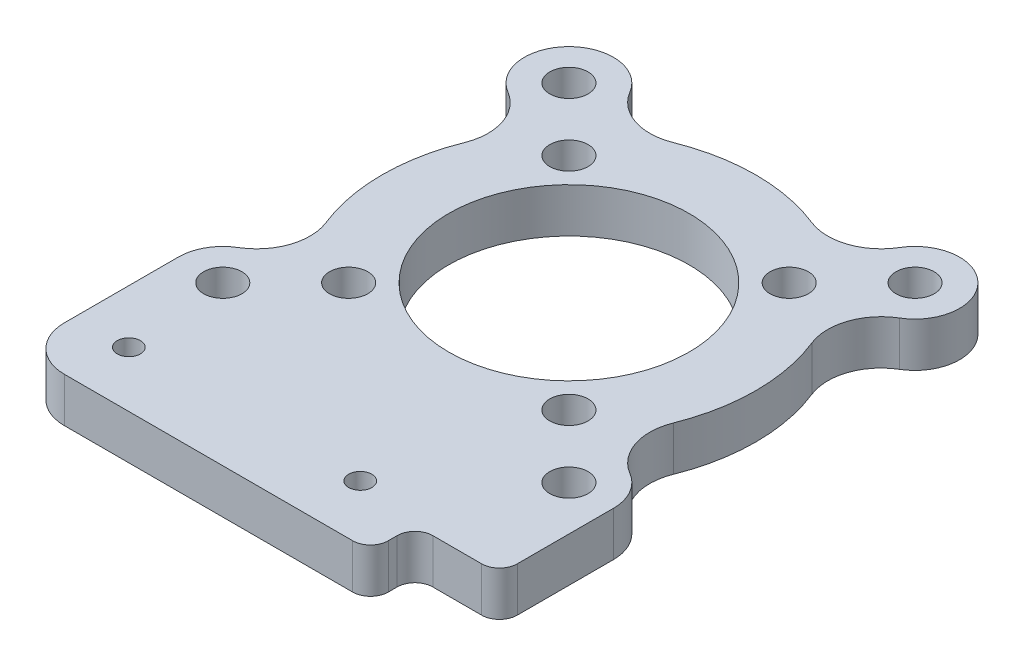
ISO-10303-21;
HEADER;
FILE_DESCRIPTION(('STEP AP214'),'2;1');
FILE_NAME('part.step','',(''),(''),'','','');
FILE_SCHEMA(('AUTOMOTIVE_DESIGN { 1 0 10303 214 1 1 1 1 }'));
ENDSEC;
DATA;
#1=APPLICATION_CONTEXT('core data for automotive mechanical design processes');
#2=APPLICATION_PROTOCOL_DEFINITION('international standard','automotive_design',2000,#1);
#3=PRODUCT_CONTEXT('',#1,'mechanical');
#4=PRODUCT('Part','Part','',(#3));
#5=PRODUCT_RELATED_PRODUCT_CATEGORY('part','',(#4));
#6=PRODUCT_DEFINITION_FORMATION('','',#4);
#7=PRODUCT_DEFINITION_CONTEXT('part definition',#1,'design');
#8=PRODUCT_DEFINITION('design','',#6,#7);
#9=PRODUCT_DEFINITION_SHAPE('','',#8);
#10=(LENGTH_UNIT() NAMED_UNIT(*) SI_UNIT(.MILLI.,.METRE.));
#11=(NAMED_UNIT(*) PLANE_ANGLE_UNIT() SI_UNIT($,.RADIAN.));
#12=(NAMED_UNIT(*) SI_UNIT($,.STERADIAN.) SOLID_ANGLE_UNIT());
#13=UNCERTAINTY_MEASURE_WITH_UNIT(LENGTH_MEASURE(1.E-05),#10,'distance_accuracy_value','');
#14=(GEOMETRIC_REPRESENTATION_CONTEXT(3) GLOBAL_UNCERTAINTY_ASSIGNED_CONTEXT((#13)) GLOBAL_UNIT_ASSIGNED_CONTEXT((#10,
#11,#12)) REPRESENTATION_CONTEXT('',''));
#15=CARTESIAN_POINT('',(0.,0.,0.));
#16=DIRECTION('',(0.,0.,1.));
#17=DIRECTION('',(1.,0.,0.));
#18=AXIS2_PLACEMENT_3D('',#15,#16,#17);
#19=CARTESIAN_POINT('',(-19.4454364826302,5.,32.25));
#20=DIRECTION('',(0.,-1.,0.));
#21=DIRECTION('',(0.,0.,-1.));
#22=AXIS2_PLACEMENT_3D('',#19,#20,#21);
#23=CYLINDRICAL_SURFACE('',#22,5.);
#24=CARTESIAN_POINT('',(-19.4454364826302,0.,32.25));
#25=DIRECTION('',(0.,1.,0.));
#26=DIRECTION('',(0.,0.,1.));
#27=AXIS2_PLACEMENT_3D('',#24,#25,#26);
#28=CIRCLE('',#27,5.);
#29=CARTESIAN_POINT('',(-19.4454364826302,0.,37.25));
#30=VERTEX_POINT('',#29);
#31=CARTESIAN_POINT('',(-24.4454364826302,0.,32.25));
#32=VERTEX_POINT('',#31);
#33=EDGE_CURVE('E193',#30,#32,#28,.F.);
#34=ORIENTED_EDGE('',*,*,#33,.F.);
#35=DIRECTION('',(0.,-1.,0.));
#36=VECTOR('',#35,1.);
#37=CARTESIAN_POINT('',(-19.4454364826302,5.,37.25));
#38=LINE('',#37,#36);
#39=CARTESIAN_POINT('',(-19.4454364826302,5.,37.25));
#40=VERTEX_POINT('',#39);
#41=EDGE_CURVE('E187',#40,#30,#38,.T.);
#42=ORIENTED_EDGE('',*,*,#41,.F.);
#43=CARTESIAN_POINT('',(-19.4454364826302,5.,32.25));
#44=DIRECTION('',(0.,1.,0.));
#45=DIRECTION('',(0.,0.,1.));
#46=AXIS2_PLACEMENT_3D('',#43,#44,#45);
#47=CIRCLE('',#46,5.);
#48=CARTESIAN_POINT('',(-24.4454364826302,5.,32.25));
#49=VERTEX_POINT('',#48);
#50=EDGE_CURVE('E190',#40,#49,#47,.F.);
#51=ORIENTED_EDGE('',*,*,#50,.T.);
#52=DIRECTION('',(0.,-1.,0.));
#53=VECTOR('',#52,1.);
#54=CARTESIAN_POINT('',(-24.4454364826302,5.,32.25));
#55=LINE('',#54,#53);
#56=EDGE_CURVE('E290',#49,#32,#55,.T.);
#57=ORIENTED_EDGE('',*,*,#56,.T.);
#58=EDGE_LOOP('',(#34,#42,#51,#57));
#59=FACE_BOUND('',#58,.T.);
#60=ADVANCED_FACE('F37',(#59),#23,.T.);
#61=CARTESIAN_POINT('',(0.,5.,37.25));
#62=DIRECTION('',(0.,0.,-1.));
#63=DIRECTION('',(-1.,0.,0.));
#64=AXIS2_PLACEMENT_3D('',#61,#62,#63);
#65=PLANE('',#64);
#66=DIRECTION('',(1.,0.,0.));
#67=VECTOR('',#66,1.);
#68=CARTESIAN_POINT('',(0.,0.,37.25));
#69=LINE('',#68,#67);
#70=CARTESIAN_POINT('',(12.95321446555,0.,37.25));
#71=VERTEX_POINT('',#70);
#72=EDGE_CURVE('E295',#30,#71,#69,.T.);
#73=ORIENTED_EDGE('',*,*,#72,.T.);
#74=DIRECTION('',(0.,-1.,0.));
#75=VECTOR('',#74,1.);
#76=CARTESIAN_POINT('',(12.95321446555,5.,37.25));
#77=LINE('',#76,#75);
#78=CARTESIAN_POINT('',(12.95321446555,5.,37.25));
#79=VERTEX_POINT('',#78);
#80=EDGE_CURVE('E204',#71,#79,#77,.F.);
#81=ORIENTED_EDGE('',*,*,#80,.T.);
#82=DIRECTION('',(1.,0.,0.));
#83=VECTOR('',#82,1.);
#84=CARTESIAN_POINT('',(0.,5.,37.25));
#85=LINE('',#84,#83);
#86=EDGE_CURVE('E201',#40,#79,#85,.T.);
#87=ORIENTED_EDGE('',*,*,#86,.F.);
#88=ORIENTED_EDGE('',*,*,#41,.T.);
#89=EDGE_LOOP('',(#73,#81,#87,#88));
#90=FACE_BOUND('',#89,.T.);
#91=ADVANCED_FACE('F202',(#90),#65,.F.);
#92=CARTESIAN_POINT('',(14.9532144655482,5.,-7.88566642110954E-13));
#93=DIRECTION('',(-1.,0.,0.));
#94=DIRECTION('',(0.,0.,1.));
#95=AXIS2_PLACEMENT_3D('',#92,#93,#94);
#96=PLANE('',#95);
#97=DIRECTION('',(0.,0.,-1.));
#98=VECTOR('',#97,1.);
#99=CARTESIAN_POINT('',(14.9532144655482,5.,-7.88566642110954E-13));
#100=LINE('',#99,#98);
#101=CARTESIAN_POINT('',(14.95321446555,5.,35.2499999999999));
#102=VERTEX_POINT('',#101);
#103=CARTESIAN_POINT('',(14.95321446555,5.,34.2500000000001));
#104=VERTEX_POINT('',#103);
#105=EDGE_CURVE('E206',#102,#104,#100,.T.);
#106=ORIENTED_EDGE('',*,*,#105,.F.);
#107=DIRECTION('',(0.,-1.,0.));
#108=VECTOR('',#107,1.);
#109=CARTESIAN_POINT('',(14.95321446555,5.,35.2499999999999));
#110=LINE('',#109,#108);
#111=CARTESIAN_POINT('',(14.95321446555,0.,35.2499999999999));
#112=VERTEX_POINT('',#111);
#113=EDGE_CURVE('E411',#102,#112,#110,.T.);
#114=ORIENTED_EDGE('',*,*,#113,.T.);
#115=DIRECTION('',(0.,0.,-1.));
#116=VECTOR('',#115,1.);
#117=CARTESIAN_POINT('',(14.9532144655482,0.,-7.88566642110954E-13));
#118=LINE('',#117,#116);
#119=CARTESIAN_POINT('',(14.95321446555,0.,34.2500000000001));
#120=VERTEX_POINT('',#119);
#121=EDGE_CURVE('E297',#112,#120,#118,.T.);
#122=ORIENTED_EDGE('',*,*,#121,.T.);
#123=DIRECTION('',(0.,-1.,0.));
#124=VECTOR('',#123,1.);
#125=CARTESIAN_POINT('',(14.95321446555,5.,34.2500000000001));
#126=LINE('',#125,#124);
#127=EDGE_CURVE('E197',#120,#104,#126,.F.);
#128=ORIENTED_EDGE('',*,*,#127,.T.);
#129=EDGE_LOOP('',(#106,#114,#122,#128));
#130=FACE_BOUND('',#129,.T.);
#131=ADVANCED_FACE('F438',(#130),#96,.F.);
#132=CARTESIAN_POINT('',(0.,5.,32.25));
#133=DIRECTION('',(0.,0.,-1.));
#134=DIRECTION('',(-1.,0.,0.));
#135=AXIS2_PLACEMENT_3D('',#132,#133,#134);
#136=PLANE('',#135);
#137=DIRECTION('',(1.,0.,0.));
#138=VECTOR('',#137,1.);
#139=CARTESIAN_POINT('',(0.,5.,32.25));
#140=LINE('',#139,#138);
#141=CARTESIAN_POINT('',(16.95321446555,5.,32.25));
#142=VERTEX_POINT('',#141);
#143=CARTESIAN_POINT('',(22.44543648263,5.,32.25));
#144=VERTEX_POINT('',#143);
#145=EDGE_CURVE('E220',#142,#144,#140,.T.);
#146=ORIENTED_EDGE('',*,*,#145,.F.);
#147=DIRECTION('',(0.,-1.,0.));
#148=VECTOR('',#147,1.);
#149=CARTESIAN_POINT('',(16.95321446555,0.,32.25));
#150=LINE('',#149,#148);
#151=CARTESIAN_POINT('',(16.95321446555,0.,32.25));
#152=VERTEX_POINT('',#151);
#153=EDGE_CURVE('E423',#142,#152,#150,.T.);
#154=ORIENTED_EDGE('',*,*,#153,.T.);
#155=DIRECTION('',(1.,0.,0.));
#156=VECTOR('',#155,1.);
#157=CARTESIAN_POINT('',(0.,0.,32.25));
#158=LINE('',#157,#156);
#159=CARTESIAN_POINT('',(22.44543648263,0.,32.25));
#160=VERTEX_POINT('',#159);
#161=EDGE_CURVE('E300',#152,#160,#158,.T.);
#162=ORIENTED_EDGE('',*,*,#161,.T.);
#163=DIRECTION('',(0.,-1.,0.));
#164=VECTOR('',#163,1.);
#165=CARTESIAN_POINT('',(22.44543648263,5.,32.25));
#166=LINE('',#165,#164);
#167=EDGE_CURVE('E60',#160,#144,#166,.F.);
#168=ORIENTED_EDGE('',*,*,#167,.T.);
#169=EDGE_LOOP('',(#146,#154,#162,#168));
#170=FACE_BOUND('',#169,.T.);
#171=ADVANCED_FACE('F442',(#170),#136,.F.);
#172=CARTESIAN_POINT('',(24.4454364826299,5.,0.));
#173=DIRECTION('',(-1.,0.,0.));
#174=DIRECTION('',(0.,0.,1.));
#175=AXIS2_PLACEMENT_3D('',#172,#173,#174);
#176=PLANE('',#175);
#177=DIRECTION('',(0.,0.,-1.));
#178=VECTOR('',#177,1.);
#179=CARTESIAN_POINT('',(24.4454364826299,5.,0.));
#180=LINE('',#179,#178);
#181=CARTESIAN_POINT('',(24.44543648263,5.,30.25));
#182=VERTEX_POINT('',#181);
#183=CARTESIAN_POINT('',(24.4454364826299,5.,19.4454364826302));
#184=VERTEX_POINT('',#183);
#185=EDGE_CURVE('E222',#182,#184,#180,.T.);
#186=ORIENTED_EDGE('',*,*,#185,.F.);
#187=DIRECTION('',(0.,-1.,0.));
#188=VECTOR('',#187,1.);
#189=CARTESIAN_POINT('',(24.44543648263,5.,30.25));
#190=LINE('',#189,#188);
#191=CARTESIAN_POINT('',(24.44543648263,0.,30.25));
#192=VERTEX_POINT('',#191);
#193=EDGE_CURVE('E426',#182,#192,#190,.T.);
#194=ORIENTED_EDGE('',*,*,#193,.T.);
#195=DIRECTION('',(0.,0.,-1.));
#196=VECTOR('',#195,1.);
#197=CARTESIAN_POINT('',(24.4454364826299,0.,0.));
#198=LINE('',#197,#196);
#199=CARTESIAN_POINT('',(24.4454364826299,0.,19.4454364826302));
#200=VERTEX_POINT('',#199);
#201=EDGE_CURVE('E302',#192,#200,#198,.T.);
#202=ORIENTED_EDGE('',*,*,#201,.T.);
#203=DIRECTION('',(0.,-1.,0.));
#204=VECTOR('',#203,1.);
#205=CARTESIAN_POINT('',(24.4454364826299,5.,19.4454364826302));
#206=LINE('',#205,#204);
#207=EDGE_CURVE('E198',#184,#200,#206,.T.);
#208=ORIENTED_EDGE('',*,*,#207,.F.);
#209=EDGE_LOOP('',(#186,#194,#202,#208));
#210=FACE_BOUND('',#209,.T.);
#211=ADVANCED_FACE('F447',(#210),#176,.F.);
#212=CARTESIAN_POINT('',(19.4454364826299,5.,19.4454364826302));
#213=DIRECTION('',(0.,-1.,0.));
#214=DIRECTION('',(0.,0.,-1.));
#215=AXIS2_PLACEMENT_3D('',#212,#213,#214);
#216=CYLINDRICAL_SURFACE('',#215,5.);
#217=CARTESIAN_POINT('',(19.4454364826299,0.,19.4454364826302));
#218=DIRECTION('',(0.,1.,0.));
#219=DIRECTION('',(0.,0.,1.));
#220=AXIS2_PLACEMENT_3D('',#217,#218,#219);
#221=CIRCLE('',#220,5.);
#222=CARTESIAN_POINT('',(22.0068293742096,0.,15.1513397842587));
#223=VERTEX_POINT('',#222);
#224=EDGE_CURVE('E304',#200,#223,#221,.T.);
#225=ORIENTED_EDGE('',*,*,#224,.T.);
#226=DIRECTION('',(0.,-1.,0.));
#227=VECTOR('',#226,1.);
#228=CARTESIAN_POINT('',(22.0068293742096,5.,15.1513397842587));
#229=LINE('',#228,#227);
#230=CARTESIAN_POINT('',(22.0068293742096,5.,15.1513397842587));
#231=VERTEX_POINT('',#230);
#232=EDGE_CURVE('E405',#231,#223,#229,.T.);
#233=ORIENTED_EDGE('',*,*,#232,.F.);
#234=CARTESIAN_POINT('',(19.4454364826299,5.,19.4454364826302));
#235=DIRECTION('',(0.,1.,0.));
#236=DIRECTION('',(0.,0.,1.));
#237=AXIS2_PLACEMENT_3D('',#234,#235,#236);
#238=CIRCLE('',#237,5.);
#239=EDGE_CURVE('E224',#184,#231,#238,.T.);
#240=ORIENTED_EDGE('',*,*,#239,.F.);
#241=ORIENTED_EDGE('',*,*,#207,.T.);
#242=EDGE_LOOP('',(#225,#233,#240,#241));
#243=FACE_BOUND('',#242,.T.);
#244=ADVANCED_FACE('F453',(#243),#216,.T.);
#245=CARTESIAN_POINT('',(25.0805008441053,5.,9.99842374621289));
#246=DIRECTION('',(0.,-1.,0.));
#247=DIRECTION('',(0.,0.,-1.));
#248=AXIS2_PLACEMENT_3D('',#245,#246,#247);
#249=CYLINDRICAL_SURFACE('',#248,6.);
#250=CARTESIAN_POINT('',(25.0805008441053,0.,9.99842374621289));
#251=DIRECTION('',(0.,1.,0.));
#252=DIRECTION('',(0.,0.,1.));
#253=AXIS2_PLACEMENT_3D('',#250,#251,#252);
#254=CIRCLE('',#253,6.);
#255=CARTESIAN_POINT('',(19.5070562120817,0.,7.77655180261042));
#256=VERTEX_POINT('',#255);
#257=EDGE_CURVE('E307',#223,#256,#254,.F.);
#258=ORIENTED_EDGE('',*,*,#257,.T.);
#259=DIRECTION('',(0.,-1.,0.));
#260=VECTOR('',#259,1.);
#261=CARTESIAN_POINT('',(19.5070562120817,5.,7.77655180261042));
#262=LINE('',#261,#260);
#263=CARTESIAN_POINT('',(19.5070562120817,5.,7.77655180261042));
#264=VERTEX_POINT('',#263);
#265=EDGE_CURVE('E402',#264,#256,#262,.T.);
#266=ORIENTED_EDGE('',*,*,#265,.F.);
#267=CARTESIAN_POINT('',(25.0805008441053,5.,9.99842374621289));
#268=DIRECTION('',(0.,1.,0.));
#269=DIRECTION('',(0.,0.,1.));
#270=AXIS2_PLACEMENT_3D('',#267,#268,#269);
#271=CIRCLE('',#270,6.);
#272=EDGE_CURVE('E227',#231,#264,#271,.F.);
#273=ORIENTED_EDGE('',*,*,#272,.F.);
#274=ORIENTED_EDGE('',*,*,#232,.T.);
#275=EDGE_LOOP('',(#258,#266,#273,#274));
#276=FACE_BOUND('',#275,.T.);
#277=ADVANCED_FACE('F458',(#276),#249,.F.);
#278=CARTESIAN_POINT('',(0.,5.,0.));
#279=DIRECTION('',(0.,-1.,0.));
#280=DIRECTION('',(0.,0.,-1.));
#281=AXIS2_PLACEMENT_3D('',#278,#279,#280);
#282=CYLINDRICAL_SURFACE('',#281,21.);
#283=CARTESIAN_POINT('',(0.,0.,0.));
#284=DIRECTION('',(0.,1.,0.));
#285=DIRECTION('',(0.,0.,1.));
#286=AXIS2_PLACEMENT_3D('',#283,#284,#285);
#287=CIRCLE('',#286,21.);
#288=CARTESIAN_POINT('',(19.507056212082,0.,-7.77655180260981));
#289=VERTEX_POINT('',#288);
#290=EDGE_CURVE('E310',#256,#289,#287,.T.);
#291=ORIENTED_EDGE('',*,*,#290,.T.);
#292=DIRECTION('',(0.,-1.,0.));
#293=VECTOR('',#292,1.);
#294=CARTESIAN_POINT('',(19.507056212082,5.,-7.77655180260981));
#295=LINE('',#294,#293);
#296=CARTESIAN_POINT('',(19.507056212082,5.,-7.77655180260981));
#297=VERTEX_POINT('',#296);
#298=EDGE_CURVE('E400',#297,#289,#295,.T.);
#299=ORIENTED_EDGE('',*,*,#298,.F.);
#300=CARTESIAN_POINT('',(0.,5.,0.));
#301=DIRECTION('',(0.,1.,0.));
#302=DIRECTION('',(0.,0.,1.));
#303=AXIS2_PLACEMENT_3D('',#300,#301,#302);
#304=CIRCLE('',#303,21.);
#305=EDGE_CURVE('E230',#264,#297,#304,.T.);
#306=ORIENTED_EDGE('',*,*,#305,.F.);
#307=ORIENTED_EDGE('',*,*,#265,.T.);
#308=EDGE_LOOP('',(#291,#299,#306,#307));
#309=FACE_BOUND('',#308,.T.);
#310=ADVANCED_FACE('F460',(#309),#282,.T.);
#311=CARTESIAN_POINT('',(25.0805008441054,5.,-9.99842374621261));
#312=DIRECTION('',(0.,-1.,0.));
#313=DIRECTION('',(0.,0.,-1.));
#314=AXIS2_PLACEMENT_3D('',#311,#312,#313);
#315=CYLINDRICAL_SURFACE('',#314,6.);
#316=CARTESIAN_POINT('',(25.0805008441054,0.,-9.99842374621261));
#317=DIRECTION('',(0.,1.,0.));
#318=DIRECTION('',(0.,0.,1.));
#319=AXIS2_PLACEMENT_3D('',#316,#317,#318);
#320=CIRCLE('',#319,6.);
#321=CARTESIAN_POINT('',(22.00682937421,0.,-15.1513397842581));
#322=VERTEX_POINT('',#321);
#323=EDGE_CURVE('E313',#322,#289,#320,.T.);
#324=ORIENTED_EDGE('',*,*,#323,.F.);
#325=DIRECTION('',(0.,-1.,0.));
#326=VECTOR('',#325,1.);
#327=CARTESIAN_POINT('',(22.00682937421,5.,-15.1513397842581));
#328=LINE('',#327,#326);
#329=CARTESIAN_POINT('',(22.00682937421,5.,-15.1513397842581));
#330=VERTEX_POINT('',#329);
#331=EDGE_CURVE('E398',#330,#322,#328,.T.);
#332=ORIENTED_EDGE('',*,*,#331,.F.);
#333=CARTESIAN_POINT('',(25.0805008441054,5.,-9.99842374621261));
#334=DIRECTION('',(0.,1.,0.));
#335=DIRECTION('',(0.,0.,1.));
#336=AXIS2_PLACEMENT_3D('',#333,#334,#335);
#337=CIRCLE('',#336,6.);
#338=EDGE_CURVE('E232',#330,#297,#337,.T.);
#339=ORIENTED_EDGE('',*,*,#338,.T.);
#340=ORIENTED_EDGE('',*,*,#298,.T.);
#341=EDGE_LOOP('',(#324,#332,#339,#340));
#342=FACE_BOUND('',#341,.T.);
#343=ADVANCED_FACE('F463',(#342),#315,.F.);
#344=CARTESIAN_POINT('',(19.4454364826306,5.,-19.4454364826295));
#345=DIRECTION('',(0.,-1.,0.));
#346=DIRECTION('',(0.,0.,-1.));
#347=AXIS2_PLACEMENT_3D('',#344,#345,#346);
#348=CYLINDRICAL_SURFACE('',#347,4.99999999999986);
#349=CARTESIAN_POINT('',(19.4454364826306,0.,-19.4454364826295));
#350=DIRECTION('',(0.,1.,0.));
#351=DIRECTION('',(0.,0.,1.));
#352=AXIS2_PLACEMENT_3D('',#349,#350,#351);
#353=CIRCLE('',#352,4.99999999999986);
#354=CARTESIAN_POINT('',(15.1513397842593,0.,-22.0068293742093));
#355=VERTEX_POINT('',#354);
#356=EDGE_CURVE('E316',#322,#355,#353,.T.);
#357=ORIENTED_EDGE('',*,*,#356,.T.);
#358=DIRECTION('',(0.,-1.,0.));
#359=VECTOR('',#358,1.);
#360=CARTESIAN_POINT('',(15.1513397842593,5.,-22.0068293742093));
#361=LINE('',#360,#359);
#362=CARTESIAN_POINT('',(15.1513397842593,5.,-22.0068293742093));
#363=VERTEX_POINT('',#362);
#364=EDGE_CURVE('E395',#363,#355,#361,.T.);
#365=ORIENTED_EDGE('',*,*,#364,.F.);
#366=CARTESIAN_POINT('',(19.4454364826306,5.,-19.4454364826295));
#367=DIRECTION('',(0.,1.,0.));
#368=DIRECTION('',(0.,0.,1.));
#369=AXIS2_PLACEMENT_3D('',#366,#367,#368);
#370=CIRCLE('',#369,4.99999999999986);
#371=EDGE_CURVE('E235',#330,#363,#370,.T.);
#372=ORIENTED_EDGE('',*,*,#371,.F.);
#373=ORIENTED_EDGE('',*,*,#331,.T.);
#374=EDGE_LOOP('',(#357,#365,#372,#373));
#375=FACE_BOUND('',#374,.T.);
#376=ADVANCED_FACE('F468',(#375),#348,.T.);
#377=CARTESIAN_POINT('',(9.99842374621287,5.,-25.0805008441053));
#378=DIRECTION('',(0.,-1.,0.));
#379=DIRECTION('',(0.,0.,-1.));
#380=AXIS2_PLACEMENT_3D('',#377,#378,#379);
#381=CYLINDRICAL_SURFACE('',#380,6.00000000000014);
#382=CARTESIAN_POINT('',(9.99842374621287,0.,-25.0805008441053));
#383=DIRECTION('',(0.,1.,0.));
#384=DIRECTION('',(0.,0.,1.));
#385=AXIS2_PLACEMENT_3D('',#382,#383,#384);
#386=CIRCLE('',#385,6.00000000000014);
#387=CARTESIAN_POINT('',(7.77655180261037,0.,-19.5070562120816));
#388=VERTEX_POINT('',#387);
#389=EDGE_CURVE('E319',#355,#388,#386,.F.);
#390=ORIENTED_EDGE('',*,*,#389,.T.);
#391=DIRECTION('',(0.,-1.,0.));
#392=VECTOR('',#391,1.);
#393=CARTESIAN_POINT('',(7.77655180261037,5.,-19.5070562120816));
#394=LINE('',#393,#392);
#395=CARTESIAN_POINT('',(7.77655180261037,5.,-19.5070562120816));
#396=VERTEX_POINT('',#395);
#397=EDGE_CURVE('E392',#396,#388,#394,.T.);
#398=ORIENTED_EDGE('',*,*,#397,.F.);
#399=CARTESIAN_POINT('',(9.99842374621287,5.,-25.0805008441053));
#400=DIRECTION('',(0.,1.,0.));
#401=DIRECTION('',(0.,0.,1.));
#402=AXIS2_PLACEMENT_3D('',#399,#400,#401);
#403=CIRCLE('',#402,6.00000000000014);
#404=EDGE_CURVE('E238',#363,#396,#403,.F.);
#405=ORIENTED_EDGE('',*,*,#404,.F.);
#406=ORIENTED_EDGE('',*,*,#364,.T.);
#407=EDGE_LOOP('',(#390,#398,#405,#406));
#408=FACE_BOUND('',#407,.T.);
#409=ADVANCED_FACE('F471',(#408),#381,.F.);
#410=CARTESIAN_POINT('',(0.,5.,0.));
#411=DIRECTION('',(0.,-1.,0.));
#412=DIRECTION('',(0.,0.,-1.));
#413=AXIS2_PLACEMENT_3D('',#410,#411,#412);
#414=CYLINDRICAL_SURFACE('',#413,21.);
#415=CARTESIAN_POINT('',(0.,0.,0.));
#416=DIRECTION('',(0.,1.,0.));
#417=DIRECTION('',(0.,0.,1.));
#418=AXIS2_PLACEMENT_3D('',#415,#416,#417);
#419=CIRCLE('',#418,21.);
#420=CARTESIAN_POINT('',(-7.77655180260982,0.,-19.507056212082));
#421=VERTEX_POINT('',#420);
#422=EDGE_CURVE('E322',#388,#421,#419,.T.);
#423=ORIENTED_EDGE('',*,*,#422,.T.);
#424=DIRECTION('',(0.,-1.,0.));
#425=VECTOR('',#424,1.);
#426=CARTESIAN_POINT('',(-7.77655180260982,5.,-19.507056212082));
#427=LINE('',#426,#425);
#428=CARTESIAN_POINT('',(-7.77655180260982,5.,-19.507056212082));
#429=VERTEX_POINT('',#428);
#430=EDGE_CURVE('E390',#429,#421,#427,.T.);
#431=ORIENTED_EDGE('',*,*,#430,.F.);
#432=CARTESIAN_POINT('',(0.,5.,0.));
#433=DIRECTION('',(0.,1.,0.));
#434=DIRECTION('',(0.,0.,1.));
#435=AXIS2_PLACEMENT_3D('',#432,#433,#434);
#436=CIRCLE('',#435,21.);
#437=EDGE_CURVE('E241',#396,#429,#436,.T.);
#438=ORIENTED_EDGE('',*,*,#437,.F.);
#439=ORIENTED_EDGE('',*,*,#397,.T.);
#440=EDGE_LOOP('',(#423,#431,#438,#439));
#441=FACE_BOUND('',#440,.T.);
#442=ADVANCED_FACE('F473',(#441),#414,.T.);
#443=CARTESIAN_POINT('',(-9.99842374621262,5.,-25.0805008441054));
#444=DIRECTION('',(0.,-1.,0.));
#445=DIRECTION('',(0.,0.,-1.));
#446=AXIS2_PLACEMENT_3D('',#443,#444,#445);
#447=CYLINDRICAL_SURFACE('',#446,5.99999999999997);
#448=CARTESIAN_POINT('',(-9.99842374621262,0.,-25.0805008441054));
#449=DIRECTION('',(0.,1.,0.));
#450=DIRECTION('',(0.,0.,1.));
#451=AXIS2_PLACEMENT_3D('',#448,#449,#450);
#452=CIRCLE('',#451,5.99999999999997);
#453=CARTESIAN_POINT('',(-15.1513397842584,0.,-22.0068293742098));
#454=VERTEX_POINT('',#453);
#455=EDGE_CURVE('E325',#454,#421,#452,.T.);
#456=ORIENTED_EDGE('',*,*,#455,.F.);
#457=DIRECTION('',(0.,-1.,0.));
#458=VECTOR('',#457,1.);
#459=CARTESIAN_POINT('',(-15.1513397842584,5.,-22.0068293742098));
#460=LINE('',#459,#458);
#461=CARTESIAN_POINT('',(-15.1513397842584,5.,-22.0068293742098));
#462=VERTEX_POINT('',#461);
#463=EDGE_CURVE('E388',#462,#454,#460,.T.);
#464=ORIENTED_EDGE('',*,*,#463,.F.);
#465=CARTESIAN_POINT('',(-9.99842374621262,5.,-25.0805008441054));
#466=DIRECTION('',(0.,1.,0.));
#467=DIRECTION('',(0.,0.,1.));
#468=AXIS2_PLACEMENT_3D('',#465,#466,#467);
#469=CIRCLE('',#468,5.99999999999997);
#470=EDGE_CURVE('E243',#462,#429,#469,.T.);
#471=ORIENTED_EDGE('',*,*,#470,.T.);
#472=ORIENTED_EDGE('',*,*,#430,.T.);
#473=EDGE_LOOP('',(#456,#464,#471,#472));
#474=FACE_BOUND('',#473,.T.);
#475=ADVANCED_FACE('F480',(#474),#447,.F.);
#476=CARTESIAN_POINT('',(-19.4454364826299,5.,-19.4454364826302));
#477=DIRECTION('',(0.,-1.,0.));
#478=DIRECTION('',(0.,0.,-1.));
#479=AXIS2_PLACEMENT_3D('',#476,#477,#478);
#480=CYLINDRICAL_SURFACE('',#479,5.);
#481=CARTESIAN_POINT('',(-19.4454364826299,0.,-19.4454364826302));
#482=DIRECTION('',(0.,1.,0.));
#483=DIRECTION('',(0.,0.,1.));
#484=AXIS2_PLACEMENT_3D('',#481,#482,#483);
#485=CIRCLE('',#484,5.);
#486=CARTESIAN_POINT('',(-22.0068293742096,0.,-15.1513397842587));
#487=VERTEX_POINT('',#486);
#488=EDGE_CURVE('E328',#454,#487,#485,.T.);
#489=ORIENTED_EDGE('',*,*,#488,.T.);
#490=DIRECTION('',(0.,-1.,0.));
#491=VECTOR('',#490,1.);
#492=CARTESIAN_POINT('',(-22.0068293742096,5.,-15.1513397842587));
#493=LINE('',#492,#491);
#494=CARTESIAN_POINT('',(-22.0068293742096,5.,-15.1513397842587));
#495=VERTEX_POINT('',#494);
#496=EDGE_CURVE('E385',#495,#487,#493,.T.);
#497=ORIENTED_EDGE('',*,*,#496,.F.);
#498=CARTESIAN_POINT('',(-19.4454364826299,5.,-19.4454364826302));
#499=DIRECTION('',(0.,1.,0.));
#500=DIRECTION('',(0.,0.,1.));
#501=AXIS2_PLACEMENT_3D('',#498,#499,#500);
#502=CIRCLE('',#501,5.);
#503=EDGE_CURVE('E246',#462,#495,#502,.T.);
#504=ORIENTED_EDGE('',*,*,#503,.F.);
#505=ORIENTED_EDGE('',*,*,#463,.T.);
#506=EDGE_LOOP('',(#489,#497,#504,#505));
#507=FACE_BOUND('',#506,.T.);
#508=ADVANCED_FACE('F483',(#507),#480,.T.);
#509=CARTESIAN_POINT('',(-25.0805008441053,5.,-9.99842374621291));
#510=DIRECTION('',(0.,-1.,0.));
#511=DIRECTION('',(0.,0.,-1.));
#512=AXIS2_PLACEMENT_3D('',#509,#510,#511);
#513=CYLINDRICAL_SURFACE('',#512,6.);
#514=CARTESIAN_POINT('',(-25.0805008441053,0.,-9.99842374621291));
#515=DIRECTION('',(0.,1.,0.));
#516=DIRECTION('',(0.,0.,1.));
#517=AXIS2_PLACEMENT_3D('',#514,#515,#516);
#518=CIRCLE('',#517,6.);
#519=CARTESIAN_POINT('',(-19.5070562120819,0.,-7.77655180261004));
#520=VERTEX_POINT('',#519);
#521=EDGE_CURVE('E331',#487,#520,#518,.F.);
#522=ORIENTED_EDGE('',*,*,#521,.T.);
#523=DIRECTION('',(0.,-1.,0.));
#524=VECTOR('',#523,1.);
#525=CARTESIAN_POINT('',(-19.5070562120819,5.,-7.77655180261004));
#526=LINE('',#525,#524);
#527=CARTESIAN_POINT('',(-19.5070562120819,5.,-7.77655180261004));
#528=VERTEX_POINT('',#527);
#529=EDGE_CURVE('E382',#528,#520,#526,.T.);
#530=ORIENTED_EDGE('',*,*,#529,.F.);
#531=CARTESIAN_POINT('',(-25.0805008441053,5.,-9.99842374621291));
#532=DIRECTION('',(0.,1.,0.));
#533=DIRECTION('',(0.,0.,1.));
#534=AXIS2_PLACEMENT_3D('',#531,#532,#533);
#535=CIRCLE('',#534,6.);
#536=EDGE_CURVE('E249',#495,#528,#535,.F.);
#537=ORIENTED_EDGE('',*,*,#536,.F.);
#538=ORIENTED_EDGE('',*,*,#496,.T.);
#539=EDGE_LOOP('',(#522,#530,#537,#538));
#540=FACE_BOUND('',#539,.T.);
#541=ADVANCED_FACE('F485',(#540),#513,.F.);
#542=CARTESIAN_POINT('',(0.,5.,0.));
#543=DIRECTION('',(0.,-1.,0.));
#544=DIRECTION('',(0.,0.,-1.));
#545=AXIS2_PLACEMENT_3D('',#542,#543,#544);
#546=CYLINDRICAL_SURFACE('',#545,21.);
#547=CARTESIAN_POINT('',(0.,0.,0.));
#548=DIRECTION('',(0.,1.,0.));
#549=DIRECTION('',(0.,0.,1.));
#550=AXIS2_PLACEMENT_3D('',#547,#548,#549);
#551=CIRCLE('',#550,21.);
#552=CARTESIAN_POINT('',(-19.507056212082,0.,7.77655180260982));
#553=VERTEX_POINT('',#552);
#554=EDGE_CURVE('E334',#520,#553,#551,.T.);
#555=ORIENTED_EDGE('',*,*,#554,.T.);
#556=DIRECTION('',(0.,-1.,0.));
#557=VECTOR('',#556,1.);
#558=CARTESIAN_POINT('',(-19.507056212082,5.,7.77655180260982));
#559=LINE('',#558,#557);
#560=CARTESIAN_POINT('',(-19.507056212082,5.,7.77655180260982));
#561=VERTEX_POINT('',#560);
#562=EDGE_CURVE('E380',#561,#553,#559,.T.);
#563=ORIENTED_EDGE('',*,*,#562,.F.);
#564=CARTESIAN_POINT('',(0.,5.,0.));
#565=DIRECTION('',(0.,1.,0.));
#566=DIRECTION('',(0.,0.,1.));
#567=AXIS2_PLACEMENT_3D('',#564,#565,#566);
#568=CIRCLE('',#567,21.);
#569=EDGE_CURVE('E252',#528,#561,#568,.T.);
#570=ORIENTED_EDGE('',*,*,#569,.F.);
#571=ORIENTED_EDGE('',*,*,#529,.T.);
#572=EDGE_LOOP('',(#555,#563,#570,#571));
#573=FACE_BOUND('',#572,.T.);
#574=ADVANCED_FACE('F490',(#573),#546,.T.);
#575=CARTESIAN_POINT('',(-25.0805008441054,5.,9.99842374621262));
#576=DIRECTION('',(0.,-1.,0.));
#577=DIRECTION('',(0.,0.,-1.));
#578=AXIS2_PLACEMENT_3D('',#575,#576,#577);
#579=CYLINDRICAL_SURFACE('',#578,5.99999999999998);
#580=CARTESIAN_POINT('',(-25.0805008441054,0.,9.99842374621262));
#581=DIRECTION('',(0.,1.,0.));
#582=DIRECTION('',(0.,0.,1.));
#583=AXIS2_PLACEMENT_3D('',#580,#581,#582);
#584=CIRCLE('',#583,5.99999999999998);
#585=CARTESIAN_POINT('',(-22.0068293742098,0.,15.1513397842584));
#586=VERTEX_POINT('',#585);
#587=EDGE_CURVE('E337',#586,#553,#584,.T.);
#588=ORIENTED_EDGE('',*,*,#587,.F.);
#589=DIRECTION('',(0.,-1.,0.));
#590=VECTOR('',#589,1.);
#591=CARTESIAN_POINT('',(-22.0068293742098,5.,15.1513397842584));
#592=LINE('',#591,#590);
#593=CARTESIAN_POINT('',(-22.0068293742098,5.,15.1513397842584));
#594=VERTEX_POINT('',#593);
#595=EDGE_CURVE('E378',#594,#586,#592,.T.);
#596=ORIENTED_EDGE('',*,*,#595,.F.);
#597=CARTESIAN_POINT('',(-25.0805008441054,5.,9.99842374621262));
#598=DIRECTION('',(0.,1.,0.));
#599=DIRECTION('',(0.,0.,1.));
#600=AXIS2_PLACEMENT_3D('',#597,#598,#599);
#601=CIRCLE('',#600,5.99999999999998);
#602=EDGE_CURVE('E254',#594,#561,#601,.T.);
#603=ORIENTED_EDGE('',*,*,#602,.T.);
#604=ORIENTED_EDGE('',*,*,#562,.T.);
#605=EDGE_LOOP('',(#588,#596,#603,#604));
#606=FACE_BOUND('',#605,.T.);
#607=ADVANCED_FACE('F493',(#606),#579,.F.);
#608=CARTESIAN_POINT('',(-19.4454364826302,5.,19.4454364826299));
#609=DIRECTION('',(0.,-1.,0.));
#610=DIRECTION('',(0.,0.,-1.));
#611=AXIS2_PLACEMENT_3D('',#608,#609,#610);
#612=CYLINDRICAL_SURFACE('',#611,4.99999999999999);
#613=CARTESIAN_POINT('',(-19.4454364826302,0.,19.4454364826299));
#614=DIRECTION('',(0.,1.,0.));
#615=DIRECTION('',(0.,0.,1.));
#616=AXIS2_PLACEMENT_3D('',#613,#614,#615);
#617=CIRCLE('',#616,4.99999999999999);
#618=CARTESIAN_POINT('',(-24.4454364826302,0.,19.44543648263));
#619=VERTEX_POINT('',#618);
#620=EDGE_CURVE('E340',#586,#619,#617,.T.);
#621=ORIENTED_EDGE('',*,*,#620,.T.);
#622=DIRECTION('',(0.,-1.,0.));
#623=VECTOR('',#622,1.);
#624=CARTESIAN_POINT('',(-24.4454364826302,5.,19.44543648263));
#625=LINE('',#624,#623);
#626=CARTESIAN_POINT('',(-24.4454364826302,5.,19.44543648263));
#627=VERTEX_POINT('',#626);
#628=EDGE_CURVE('E376',#627,#619,#625,.T.);
#629=ORIENTED_EDGE('',*,*,#628,.F.);
#630=CARTESIAN_POINT('',(-19.4454364826302,5.,19.4454364826299));
#631=DIRECTION('',(0.,1.,0.));
#632=DIRECTION('',(0.,0.,1.));
#633=AXIS2_PLACEMENT_3D('',#630,#631,#632);
#634=CIRCLE('',#633,4.99999999999999);
#635=EDGE_CURVE('E257',#594,#627,#634,.T.);
#636=ORIENTED_EDGE('',*,*,#635,.F.);
#637=ORIENTED_EDGE('',*,*,#595,.T.);
#638=EDGE_LOOP('',(#621,#629,#636,#637));
#639=FACE_BOUND('',#638,.T.);
#640=ADVANCED_FACE('F498',(#639),#612,.T.);
#641=CARTESIAN_POINT('',(12.3743686707646,5.,-12.3743686707646));
#642=DIRECTION('',(0.,-1.,0.));
#643=DIRECTION('',(0.,0.,-1.));
#644=AXIS2_PLACEMENT_3D('',#641,#642,#643);
#645=CYLINDRICAL_SURFACE('',#644,2.15000000000001);
#646=CARTESIAN_POINT('',(12.3743686707646,5.,-12.3743686707646));
#647=DIRECTION('',(0.,1.,0.));
#648=DIRECTION('',(0.,0.,1.));
#649=AXIS2_PLACEMENT_3D('',#646,#647,#648);
#650=CIRCLE('',#649,2.15000000000001);
#651=CARTESIAN_POINT('',(12.3743686707646,5.,-10.2243686707646));
#652=VERTEX_POINT('',#651);
#653=EDGE_CURVE('E284',#652,#652,#650,.T.);
#654=ORIENTED_EDGE('',*,*,#653,.T.);
#655=EDGE_LOOP('',(#654));
#656=FACE_BOUND('',#655,.T.);
#657=CARTESIAN_POINT('',(12.3743686707646,0.,-12.3743686707646));
#658=DIRECTION('',(0.,1.,0.));
#659=DIRECTION('',(0.,0.,1.));
#660=AXIS2_PLACEMENT_3D('',#657,#658,#659);
#661=CIRCLE('',#660,2.15000000000001);
#662=CARTESIAN_POINT('',(12.3743686707646,0.,-10.2243686707646));
#663=VERTEX_POINT('',#662);
#664=EDGE_CURVE('E370',#663,#663,#661,.T.);
#665=ORIENTED_EDGE('',*,*,#664,.F.);
#666=EDGE_LOOP('',(#665));
#667=FACE_BOUND('',#666,.T.);
#668=ADVANCED_FACE('F541',(#656,#667),#645,.F.);
#669=CARTESIAN_POINT('',(12.3743686707646,5.,12.3743686707646));
#670=DIRECTION('',(0.,-1.,0.));
#671=DIRECTION('',(0.,0.,-1.));
#672=AXIS2_PLACEMENT_3D('',#669,#670,#671);
#673=CYLINDRICAL_SURFACE('',#672,2.15);
#674=CARTESIAN_POINT('',(12.3743686707646,5.,12.3743686707646));
#675=DIRECTION('',(0.,1.,0.));
#676=DIRECTION('',(0.,0.,1.));
#677=AXIS2_PLACEMENT_3D('',#674,#675,#676);
#678=CIRCLE('',#677,2.15);
#679=CARTESIAN_POINT('',(12.3743686707646,5.,14.5243686707646));
#680=VERTEX_POINT('',#679);
#681=EDGE_CURVE('E281',#680,#680,#678,.T.);
#682=ORIENTED_EDGE('',*,*,#681,.T.);
#683=EDGE_LOOP('',(#682));
#684=FACE_BOUND('',#683,.T.);
#685=CARTESIAN_POINT('',(12.3743686707646,0.,12.3743686707646));
#686=DIRECTION('',(0.,1.,0.));
#687=DIRECTION('',(0.,0.,1.));
#688=AXIS2_PLACEMENT_3D('',#685,#686,#687);
#689=CIRCLE('',#688,2.15);
#690=CARTESIAN_POINT('',(12.3743686707646,0.,14.5243686707646));
#691=VERTEX_POINT('',#690);
#692=EDGE_CURVE('E367',#691,#691,#689,.T.);
#693=ORIENTED_EDGE('',*,*,#692,.F.);
#694=EDGE_LOOP('',(#693));
#695=FACE_BOUND('',#694,.T.);
#696=ADVANCED_FACE('F544',(#684,#695),#673,.F.);
#697=CARTESIAN_POINT('',(-12.3743686707646,5.,12.3743686707646));
#698=DIRECTION('',(0.,-1.,0.));
#699=DIRECTION('',(0.,0.,-1.));
#700=AXIS2_PLACEMENT_3D('',#697,#698,#699);
#701=CYLINDRICAL_SURFACE('',#700,2.15);
#702=CARTESIAN_POINT('',(-12.3743686707646,5.,12.3743686707646));
#703=DIRECTION('',(0.,1.,0.));
#704=DIRECTION('',(0.,0.,1.));
#705=AXIS2_PLACEMENT_3D('',#702,#703,#704);
#706=CIRCLE('',#705,2.15);
#707=CARTESIAN_POINT('',(-12.3743686707646,5.,14.5243686707646));
#708=VERTEX_POINT('',#707);
#709=EDGE_CURVE('E278',#708,#708,#706,.T.);
#710=ORIENTED_EDGE('',*,*,#709,.T.);
#711=EDGE_LOOP('',(#710));
#712=FACE_BOUND('',#711,.T.);
#713=CARTESIAN_POINT('',(-12.3743686707646,0.,12.3743686707646));
#714=DIRECTION('',(0.,1.,0.));
#715=DIRECTION('',(0.,0.,1.));
#716=AXIS2_PLACEMENT_3D('',#713,#714,#715);
#717=CIRCLE('',#716,2.15);
#718=CARTESIAN_POINT('',(-12.3743686707646,0.,14.5243686707646));
#719=VERTEX_POINT('',#718);
#720=EDGE_CURVE('E364',#719,#719,#717,.T.);
#721=ORIENTED_EDGE('',*,*,#720,.F.);
#722=EDGE_LOOP('',(#721));
#723=FACE_BOUND('',#722,.T.);
#724=ADVANCED_FACE('F548',(#712,#723),#701,.F.);
#725=CARTESIAN_POINT('',(-12.3743686707646,5.,-12.3743686707646));
#726=DIRECTION('',(0.,-1.,0.));
#727=DIRECTION('',(0.,0.,-1.));
#728=AXIS2_PLACEMENT_3D('',#725,#726,#727);
#729=CYLINDRICAL_SURFACE('',#728,2.15);
#730=CARTESIAN_POINT('',(-12.3743686707646,5.,-12.3743686707646));
#731=DIRECTION('',(0.,1.,0.));
#732=DIRECTION('',(0.,0.,1.));
#733=AXIS2_PLACEMENT_3D('',#730,#731,#732);
#734=CIRCLE('',#733,2.15);
#735=CARTESIAN_POINT('',(-12.3743686707646,5.,-10.2243686707646));
#736=VERTEX_POINT('',#735);
#737=EDGE_CURVE('E275',#736,#736,#734,.T.);
#738=ORIENTED_EDGE('',*,*,#737,.T.);
#739=EDGE_LOOP('',(#738));
#740=FACE_BOUND('',#739,.T.);
#741=CARTESIAN_POINT('',(-12.3743686707646,0.,-12.3743686707646));
#742=DIRECTION('',(0.,1.,0.));
#743=DIRECTION('',(0.,0.,1.));
#744=AXIS2_PLACEMENT_3D('',#741,#742,#743);
#745=CIRCLE('',#744,2.15);
#746=CARTESIAN_POINT('',(-12.3743686707646,0.,-10.2243686707646));
#747=VERTEX_POINT('',#746);
#748=EDGE_CURVE('E361',#747,#747,#745,.T.);
#749=ORIENTED_EDGE('',*,*,#748,.F.);
#750=EDGE_LOOP('',(#749));
#751=FACE_BOUND('',#750,.T.);
#752=ADVANCED_FACE('F552',(#740,#751),#729,.F.);
#753=CARTESIAN_POINT('',(19.4454364826306,5.,-19.4454364826295));
#754=DIRECTION('',(0.,-1.,0.));
#755=DIRECTION('',(0.,0.,-1.));
#756=AXIS2_PLACEMENT_3D('',#753,#754,#755);
#757=CYLINDRICAL_SURFACE('',#756,2.14999999999973);
#758=CARTESIAN_POINT('',(19.4454364826306,5.,-19.4454364826295));
#759=DIRECTION('',(0.,1.,0.));
#760=DIRECTION('',(0.,0.,1.));
#761=AXIS2_PLACEMENT_3D('',#758,#759,#760);
#762=CIRCLE('',#761,2.14999999999973);
#763=CARTESIAN_POINT('',(19.4454364826306,5.,-17.2954364826298));
#764=VERTEX_POINT('',#763);
#765=EDGE_CURVE('E272',#764,#764,#762,.T.);
#766=ORIENTED_EDGE('',*,*,#765,.T.);
#767=EDGE_LOOP('',(#766));
#768=FACE_BOUND('',#767,.T.);
#769=CARTESIAN_POINT('',(19.4454364826306,0.,-19.4454364826295));
#770=DIRECTION('',(0.,1.,0.));
#771=DIRECTION('',(0.,0.,1.));
#772=AXIS2_PLACEMENT_3D('',#769,#770,#771);
#773=CIRCLE('',#772,2.14999999999973);
#774=CARTESIAN_POINT('',(19.4454364826306,0.,-17.2954364826298));
#775=VERTEX_POINT('',#774);
#776=EDGE_CURVE('E358',#775,#775,#773,.T.);
#777=ORIENTED_EDGE('',*,*,#776,.F.);
#778=EDGE_LOOP('',(#777));
#779=FACE_BOUND('',#778,.T.);
#780=ADVANCED_FACE('F556',(#768,#779),#757,.F.);
#781=CARTESIAN_POINT('',(19.4454364826299,5.,19.4454364826302));
#782=DIRECTION('',(0.,-1.,0.));
#783=DIRECTION('',(0.,0.,-1.));
#784=AXIS2_PLACEMENT_3D('',#781,#782,#783);
#785=CYLINDRICAL_SURFACE('',#784,2.15);
#786=CARTESIAN_POINT('',(19.4454364826299,5.,19.4454364826302));
#787=DIRECTION('',(0.,1.,0.));
#788=DIRECTION('',(0.,0.,1.));
#789=AXIS2_PLACEMENT_3D('',#786,#787,#788);
#790=CIRCLE('',#789,2.15);
#791=CARTESIAN_POINT('',(19.4454364826299,5.,21.5954364826302));
#792=VERTEX_POINT('',#791);
#793=EDGE_CURVE('E269',#792,#792,#790,.T.);
#794=ORIENTED_EDGE('',*,*,#793,.T.);
#795=EDGE_LOOP('',(#794));
#796=FACE_BOUND('',#795,.T.);
#797=CARTESIAN_POINT('',(19.4454364826299,0.,19.4454364826302));
#798=DIRECTION('',(0.,1.,0.));
#799=DIRECTION('',(0.,0.,1.));
#800=AXIS2_PLACEMENT_3D('',#797,#798,#799);
#801=CIRCLE('',#800,2.15);
#802=CARTESIAN_POINT('',(19.4454364826299,0.,21.5954364826302));
#803=VERTEX_POINT('',#802);
#804=EDGE_CURVE('E355',#803,#803,#801,.T.);
#805=ORIENTED_EDGE('',*,*,#804,.F.);
#806=EDGE_LOOP('',(#805));
#807=FACE_BOUND('',#806,.T.);
#808=ADVANCED_FACE('F560',(#796,#807),#785,.F.);
#809=CARTESIAN_POINT('',(-19.4454364826302,5.,19.4454364826299));
#810=DIRECTION('',(0.,-1.,0.));
#811=DIRECTION('',(0.,0.,-1.));
#812=AXIS2_PLACEMENT_3D('',#809,#810,#811);
#813=CYLINDRICAL_SURFACE('',#812,2.15);
#814=CARTESIAN_POINT('',(-19.4454364826302,5.,19.4454364826299));
#815=DIRECTION('',(0.,1.,0.));
#816=DIRECTION('',(0.,0.,1.));
#817=AXIS2_PLACEMENT_3D('',#814,#815,#816);
#818=CIRCLE('',#817,2.15);
#819=CARTESIAN_POINT('',(-19.4454364826302,5.,21.5954364826299));
#820=VERTEX_POINT('',#819);
#821=EDGE_CURVE('E266',#820,#820,#818,.T.);
#822=ORIENTED_EDGE('',*,*,#821,.T.);
#823=EDGE_LOOP('',(#822));
#824=FACE_BOUND('',#823,.T.);
#825=CARTESIAN_POINT('',(-19.4454364826302,0.,19.4454364826299));
#826=DIRECTION('',(0.,1.,0.));
#827=DIRECTION('',(0.,0.,1.));
#828=AXIS2_PLACEMENT_3D('',#825,#826,#827);
#829=CIRCLE('',#828,2.15);
#830=CARTESIAN_POINT('',(-19.4454364826302,0.,21.5954364826299));
#831=VERTEX_POINT('',#830);
#832=EDGE_CURVE('E352',#831,#831,#829,.T.);
#833=ORIENTED_EDGE('',*,*,#832,.F.);
#834=EDGE_LOOP('',(#833));
#835=FACE_BOUND('',#834,.T.);
#836=ADVANCED_FACE('F564',(#824,#835),#813,.F.);
#837=CARTESIAN_POINT('',(-19.4454364826299,5.,-19.4454364826302));
#838=DIRECTION('',(0.,-1.,0.));
#839=DIRECTION('',(0.,0.,-1.));
#840=AXIS2_PLACEMENT_3D('',#837,#838,#839);
#841=CYLINDRICAL_SURFACE('',#840,2.15);
#842=CARTESIAN_POINT('',(-19.4454364826299,5.,-19.4454364826302));
#843=DIRECTION('',(0.,1.,0.));
#844=DIRECTION('',(0.,0.,1.));
#845=AXIS2_PLACEMENT_3D('',#842,#843,#844);
#846=CIRCLE('',#845,2.15);
#847=CARTESIAN_POINT('',(-19.4454364826299,5.,-17.2954364826302));
#848=VERTEX_POINT('',#847);
#849=EDGE_CURVE('E263',#848,#848,#846,.T.);
#850=ORIENTED_EDGE('',*,*,#849,.T.);
#851=EDGE_LOOP('',(#850));
#852=FACE_BOUND('',#851,.T.);
#853=CARTESIAN_POINT('',(-19.4454364826299,0.,-19.4454364826302));
#854=DIRECTION('',(0.,1.,0.));
#855=DIRECTION('',(0.,0.,1.));
#856=AXIS2_PLACEMENT_3D('',#853,#854,#855);
#857=CIRCLE('',#856,2.15);
#858=CARTESIAN_POINT('',(-19.4454364826299,0.,-17.2954364826302));
#859=VERTEX_POINT('',#858);
#860=EDGE_CURVE('E349',#859,#859,#857,.T.);
#861=ORIENTED_EDGE('',*,*,#860,.F.);
#862=EDGE_LOOP('',(#861));
#863=FACE_BOUND('',#862,.T.);
#864=ADVANCED_FACE('F568',(#852,#863),#841,.F.);
#865=CARTESIAN_POINT('',(7.55456351736985,5.,31.));
#866=DIRECTION('',(0.,-1.,0.));
#867=DIRECTION('',(0.,0.,-1.));
#868=AXIS2_PLACEMENT_3D('',#865,#866,#867);
#869=CYLINDRICAL_SURFACE('',#868,1.3);
#870=CARTESIAN_POINT('',(7.55456351736985,5.,31.));
#871=DIRECTION('',(0.,1.,0.));
#872=DIRECTION('',(0.,0.,1.));
#873=AXIS2_PLACEMENT_3D('',#870,#871,#872);
#874=CIRCLE('',#873,1.3);
#875=CARTESIAN_POINT('',(7.55456351736985,5.,32.3));
#876=VERTEX_POINT('',#875);
#877=EDGE_CURVE('E260',#876,#876,#874,.T.);
#878=ORIENTED_EDGE('',*,*,#877,.T.);
#879=EDGE_LOOP('',(#878));
#880=FACE_BOUND('',#879,.T.);
#881=CARTESIAN_POINT('',(7.55456351736985,0.,31.));
#882=DIRECTION('',(0.,1.,0.));
#883=DIRECTION('',(0.,0.,1.));
#884=AXIS2_PLACEMENT_3D('',#881,#882,#883);
#885=CIRCLE('',#884,1.3);
#886=CARTESIAN_POINT('',(7.55456351736985,0.,32.3));
#887=VERTEX_POINT('',#886);
#888=EDGE_CURVE('E346',#887,#887,#885,.T.);
#889=ORIENTED_EDGE('',*,*,#888,.F.);
#890=EDGE_LOOP('',(#889));
#891=FACE_BOUND('',#890,.T.);
#892=ADVANCED_FACE('F530',(#880,#891),#869,.F.);
#893=CARTESIAN_POINT('',(-24.4454364826302,5.,0.));
#894=DIRECTION('',(-1.,0.,0.));
#895=DIRECTION('',(0.,0.,1.));
#896=AXIS2_PLACEMENT_3D('',#893,#894,#895);
#897=PLANE('',#896);
#898=DIRECTION('',(0.,0.,-1.));
#899=VECTOR('',#898,1.);
#900=CARTESIAN_POINT('',(-24.4454364826302,0.,0.));
#901=LINE('',#900,#899);
#902=EDGE_CURVE('E343',#32,#619,#901,.T.);
#903=ORIENTED_EDGE('',*,*,#902,.F.);
#904=ORIENTED_EDGE('',*,*,#56,.F.);
#905=DIRECTION('',(0.,0.,-1.));
#906=VECTOR('',#905,1.);
#907=CARTESIAN_POINT('',(-24.4454364826302,5.,0.));
#908=LINE('',#907,#906);
#909=EDGE_CURVE('E211',#49,#627,#908,.T.);
#910=ORIENTED_EDGE('',*,*,#909,.T.);
#911=ORIENTED_EDGE('',*,*,#628,.T.);
#912=EDGE_LOOP('',(#903,#904,#910,#911));
#913=FACE_BOUND('',#912,.T.);
#914=ADVANCED_FACE('F501',(#913),#897,.T.);
#915=CARTESIAN_POINT('',(-18.4454364826302,5.,31.));
#916=DIRECTION('',(0.,-1.,0.));
#917=DIRECTION('',(0.,0.,-1.));
#918=AXIS2_PLACEMENT_3D('',#915,#916,#917);
#919=CYLINDRICAL_SURFACE('',#918,1.3);
#920=CARTESIAN_POINT('',(-18.4454364826302,5.,31.));
#921=DIRECTION('',(0.,1.,0.));
#922=DIRECTION('',(0.,0.,1.));
#923=AXIS2_PLACEMENT_3D('',#920,#921,#922);
#924=CIRCLE('',#923,1.3);
#925=CARTESIAN_POINT('',(-18.4454364826302,5.,32.3));
#926=VERTEX_POINT('',#925);
#927=EDGE_CURVE('E212',#926,#926,#924,.T.);
#928=ORIENTED_EDGE('',*,*,#927,.T.);
#929=EDGE_LOOP('',(#928));
#930=FACE_BOUND('',#929,.T.);
#931=CARTESIAN_POINT('',(-18.4454364826302,0.,31.));
#932=DIRECTION('',(0.,1.,0.));
#933=DIRECTION('',(0.,0.,1.));
#934=AXIS2_PLACEMENT_3D('',#931,#932,#933);
#935=CIRCLE('',#934,1.3);
#936=CARTESIAN_POINT('',(-18.4454364826302,0.,32.3));
#937=VERTEX_POINT('',#936);
#938=EDGE_CURVE('E291',#937,#937,#935,.T.);
#939=ORIENTED_EDGE('',*,*,#938,.F.);
#940=EDGE_LOOP('',(#939));
#941=FACE_BOUND('',#940,.T.);
#942=ADVANCED_FACE('F520',(#930,#941),#919,.F.);
#943=CARTESIAN_POINT('',(0.,5.,0.));
#944=DIRECTION('',(0.,-1.,0.));
#945=DIRECTION('',(0.,0.,-1.));
#946=AXIS2_PLACEMENT_3D('',#943,#944,#945);
#947=CYLINDRICAL_SURFACE('',#946,13.5);
#948=CARTESIAN_POINT('',(0.,5.,0.));
#949=DIRECTION('',(0.,1.,0.));
#950=DIRECTION('',(0.,0.,1.));
#951=AXIS2_PLACEMENT_3D('',#948,#949,#950);
#952=CIRCLE('',#951,13.5);
#953=CARTESIAN_POINT('',(0.,5.,13.5));
#954=VERTEX_POINT('',#953);
#955=EDGE_CURVE('E287',#954,#954,#952,.T.);
#956=ORIENTED_EDGE('',*,*,#955,.T.);
#957=EDGE_LOOP('',(#956));
#958=FACE_BOUND('',#957,.T.);
#959=CARTESIAN_POINT('',(0.,0.,0.));
#960=DIRECTION('',(0.,1.,0.));
#961=DIRECTION('',(0.,0.,1.));
#962=AXIS2_PLACEMENT_3D('',#959,#960,#961);
#963=CIRCLE('',#962,13.5);
#964=CARTESIAN_POINT('',(0.,0.,13.5));
#965=VERTEX_POINT('',#964);
#966=EDGE_CURVE('E215',#965,#965,#963,.T.);
#967=ORIENTED_EDGE('',*,*,#966,.F.);
#968=EDGE_LOOP('',(#967));
#969=FACE_BOUND('',#968,.T.);
#970=ADVANCED_FACE('F522',(#958,#969),#947,.F.);
#971=CARTESIAN_POINT('',(0.,5.,0.));
#972=DIRECTION('',(0.,1.,0.));
#973=DIRECTION('',(0.,0.,1.));
#974=AXIS2_PLACEMENT_3D('',#971,#972,#973);
#975=PLANE('',#974);
#976=ORIENTED_EDGE('',*,*,#927,.F.);
#977=EDGE_LOOP('',(#976));
#978=FACE_BOUND('',#977,.T.);
#979=ORIENTED_EDGE('',*,*,#86,.T.);
#980=CARTESIAN_POINT('',(12.95321446555,5.,35.25));
#981=DIRECTION('',(0.,1.,0.));
#982=DIRECTION('',(0.,0.,1.));
#983=AXIS2_PLACEMENT_3D('',#980,#981,#982);
#984=CIRCLE('',#983,2.);
#985=EDGE_CURVE('E420',#79,#102,#984,.T.);
#986=ORIENTED_EDGE('',*,*,#985,.T.);
#987=ORIENTED_EDGE('',*,*,#105,.T.);
#988=CARTESIAN_POINT('',(16.95321446555,5.,34.25));
#989=DIRECTION('',(0.,1.,0.));
#990=DIRECTION('',(0.,0.,1.));
#991=AXIS2_PLACEMENT_3D('',#988,#989,#990);
#992=CIRCLE('',#991,2.);
#993=EDGE_CURVE('E11',#104,#142,#992,.F.);
#994=ORIENTED_EDGE('',*,*,#993,.T.);
#995=ORIENTED_EDGE('',*,*,#145,.T.);
#996=CARTESIAN_POINT('',(22.44543648263,5.,30.25));
#997=DIRECTION('',(0.,1.,0.));
#998=DIRECTION('',(0.,0.,1.));
#999=AXIS2_PLACEMENT_3D('',#996,#997,#998);
#1000=CIRCLE('',#999,2.);
#1001=EDGE_CURVE('E52',#144,#182,#1000,.T.);
#1002=ORIENTED_EDGE('',*,*,#1001,.T.);
#1003=ORIENTED_EDGE('',*,*,#185,.T.);
#1004=ORIENTED_EDGE('',*,*,#239,.T.);
#1005=ORIENTED_EDGE('',*,*,#272,.T.);
#1006=ORIENTED_EDGE('',*,*,#305,.T.);
#1007=ORIENTED_EDGE('',*,*,#338,.F.);
#1008=ORIENTED_EDGE('',*,*,#371,.T.);
#1009=ORIENTED_EDGE('',*,*,#404,.T.);
#1010=ORIENTED_EDGE('',*,*,#437,.T.);
#1011=ORIENTED_EDGE('',*,*,#470,.F.);
#1012=ORIENTED_EDGE('',*,*,#503,.T.);
#1013=ORIENTED_EDGE('',*,*,#536,.T.);
#1014=ORIENTED_EDGE('',*,*,#569,.T.);
#1015=ORIENTED_EDGE('',*,*,#602,.F.);
#1016=ORIENTED_EDGE('',*,*,#635,.T.);
#1017=ORIENTED_EDGE('',*,*,#909,.F.);
#1018=ORIENTED_EDGE('',*,*,#50,.F.);
#1019=EDGE_LOOP('',(#979,#986,#987,#994,#995,#1002,#1003,#1004,#1005,#1006,#1007,#1008,#1009,
#1010,#1011,#1012,#1013,#1014,#1015,#1016,#1017,#1018));
#1020=FACE_BOUND('',#1019,.T.);
#1021=ORIENTED_EDGE('',*,*,#877,.F.);
#1022=EDGE_LOOP('',(#1021));
#1023=FACE_BOUND('',#1022,.T.);
#1024=ORIENTED_EDGE('',*,*,#849,.F.);
#1025=EDGE_LOOP('',(#1024));
#1026=FACE_BOUND('',#1025,.T.);
#1027=ORIENTED_EDGE('',*,*,#821,.F.);
#1028=EDGE_LOOP('',(#1027));
#1029=FACE_BOUND('',#1028,.T.);
#1030=ORIENTED_EDGE('',*,*,#793,.F.);
#1031=EDGE_LOOP('',(#1030));
#1032=FACE_BOUND('',#1031,.T.);
#1033=ORIENTED_EDGE('',*,*,#765,.F.);
#1034=EDGE_LOOP('',(#1033));
#1035=FACE_BOUND('',#1034,.T.);
#1036=ORIENTED_EDGE('',*,*,#737,.F.);
#1037=EDGE_LOOP('',(#1036));
#1038=FACE_BOUND('',#1037,.T.);
#1039=ORIENTED_EDGE('',*,*,#709,.F.);
#1040=EDGE_LOOP('',(#1039));
#1041=FACE_BOUND('',#1040,.T.);
#1042=ORIENTED_EDGE('',*,*,#681,.F.);
#1043=EDGE_LOOP('',(#1042));
#1044=FACE_BOUND('',#1043,.T.);
#1045=ORIENTED_EDGE('',*,*,#653,.F.);
#1046=EDGE_LOOP('',(#1045));
#1047=FACE_BOUND('',#1046,.T.);
#1048=ORIENTED_EDGE('',*,*,#955,.F.);
#1049=EDGE_LOOP('',(#1048));
#1050=FACE_BOUND('',#1049,.T.);
#1051=ADVANCED_FACE('F208',(#978,#1020,#1023,#1026,#1029,#1032,#1035,#1038,#1041,#1044,#1047,
#1050),#975,.T.);
#1052=CARTESIAN_POINT('',(0.,0.,0.));
#1053=DIRECTION('',(0.,1.,0.));
#1054=DIRECTION('',(0.,0.,1.));
#1055=AXIS2_PLACEMENT_3D('',#1052,#1053,#1054);
#1056=PLANE('',#1055);
#1057=ORIENTED_EDGE('',*,*,#938,.T.);
#1058=EDGE_LOOP('',(#1057));
#1059=FACE_BOUND('',#1058,.T.);
#1060=ORIENTED_EDGE('',*,*,#121,.F.);
#1061=CARTESIAN_POINT('',(12.95321446555,0.,35.25));
#1062=DIRECTION('',(0.,1.,0.));
#1063=DIRECTION('',(0.,0.,1.));
#1064=AXIS2_PLACEMENT_3D('',#1061,#1062,#1063);
#1065=CIRCLE('',#1064,2.);
#1066=EDGE_CURVE('E416',#112,#71,#1065,.F.);
#1067=ORIENTED_EDGE('',*,*,#1066,.T.);
#1068=ORIENTED_EDGE('',*,*,#72,.F.);
#1069=ORIENTED_EDGE('',*,*,#33,.T.);
#1070=ORIENTED_EDGE('',*,*,#902,.T.);
#1071=ORIENTED_EDGE('',*,*,#620,.F.);
#1072=ORIENTED_EDGE('',*,*,#587,.T.);
#1073=ORIENTED_EDGE('',*,*,#554,.F.);
#1074=ORIENTED_EDGE('',*,*,#521,.F.);
#1075=ORIENTED_EDGE('',*,*,#488,.F.);
#1076=ORIENTED_EDGE('',*,*,#455,.T.);
#1077=ORIENTED_EDGE('',*,*,#422,.F.);
#1078=ORIENTED_EDGE('',*,*,#389,.F.);
#1079=ORIENTED_EDGE('',*,*,#356,.F.);
#1080=ORIENTED_EDGE('',*,*,#323,.T.);
#1081=ORIENTED_EDGE('',*,*,#290,.F.);
#1082=ORIENTED_EDGE('',*,*,#257,.F.);
#1083=ORIENTED_EDGE('',*,*,#224,.F.);
#1084=ORIENTED_EDGE('',*,*,#201,.F.);
#1085=CARTESIAN_POINT('',(22.44543648263,0.,30.25));
#1086=DIRECTION('',(0.,1.,0.));
#1087=DIRECTION('',(0.,0.,1.));
#1088=AXIS2_PLACEMENT_3D('',#1085,#1086,#1087);
#1089=CIRCLE('',#1088,2.);
#1090=EDGE_CURVE('E414',#192,#160,#1089,.F.);
#1091=ORIENTED_EDGE('',*,*,#1090,.T.);
#1092=ORIENTED_EDGE('',*,*,#161,.F.);
#1093=CARTESIAN_POINT('',(16.95321446555,0.,34.25));
#1094=DIRECTION('',(0.,1.,0.));
#1095=DIRECTION('',(0.,0.,1.));
#1096=AXIS2_PLACEMENT_3D('',#1093,#1094,#1095);
#1097=CIRCLE('',#1096,2.);
#1098=EDGE_CURVE('E45',#152,#120,#1097,.T.);
#1099=ORIENTED_EDGE('',*,*,#1098,.T.);
#1100=EDGE_LOOP('',(#1060,#1067,#1068,#1069,#1070,#1071,#1072,#1073,#1074,#1075,#1076,#1077,
#1078,#1079,#1080,#1081,#1082,#1083,#1084,#1091,#1092,#1099));
#1101=FACE_BOUND('',#1100,.T.);
#1102=ORIENTED_EDGE('',*,*,#888,.T.);
#1103=EDGE_LOOP('',(#1102));
#1104=FACE_BOUND('',#1103,.T.);
#1105=ORIENTED_EDGE('',*,*,#860,.T.);
#1106=EDGE_LOOP('',(#1105));
#1107=FACE_BOUND('',#1106,.T.);
#1108=ORIENTED_EDGE('',*,*,#832,.T.);
#1109=EDGE_LOOP('',(#1108));
#1110=FACE_BOUND('',#1109,.T.);
#1111=ORIENTED_EDGE('',*,*,#804,.T.);
#1112=EDGE_LOOP('',(#1111));
#1113=FACE_BOUND('',#1112,.T.);
#1114=ORIENTED_EDGE('',*,*,#776,.T.);
#1115=EDGE_LOOP('',(#1114));
#1116=FACE_BOUND('',#1115,.T.);
#1117=ORIENTED_EDGE('',*,*,#748,.T.);
#1118=EDGE_LOOP('',(#1117));
#1119=FACE_BOUND('',#1118,.T.);
#1120=ORIENTED_EDGE('',*,*,#720,.T.);
#1121=EDGE_LOOP('',(#1120));
#1122=FACE_BOUND('',#1121,.T.);
#1123=ORIENTED_EDGE('',*,*,#692,.T.);
#1124=EDGE_LOOP('',(#1123));
#1125=FACE_BOUND('',#1124,.T.);
#1126=ORIENTED_EDGE('',*,*,#664,.T.);
#1127=EDGE_LOOP('',(#1126));
#1128=FACE_BOUND('',#1127,.T.);
#1129=ORIENTED_EDGE('',*,*,#966,.T.);
#1130=EDGE_LOOP('',(#1129));
#1131=FACE_BOUND('',#1130,.T.);
#1132=ADVANCED_FACE('F431',(#1059,#1101,#1104,#1107,#1110,#1113,#1116,#1119,#1122,#1125,#1128,
#1131),#1056,.F.);
#1133=CARTESIAN_POINT('',(12.95321446555,5.,35.25));
#1134=DIRECTION('',(0.,-1.,0.));
#1135=DIRECTION('',(0.,0.,-1.));
#1136=AXIS2_PLACEMENT_3D('',#1133,#1134,#1135);
#1137=CYLINDRICAL_SURFACE('',#1136,2.);
#1138=ORIENTED_EDGE('',*,*,#985,.F.);
#1139=ORIENTED_EDGE('',*,*,#80,.F.);
#1140=ORIENTED_EDGE('',*,*,#1066,.F.);
#1141=ORIENTED_EDGE('',*,*,#113,.F.);
#1142=EDGE_LOOP('',(#1138,#1139,#1140,#1141));
#1143=FACE_BOUND('',#1142,.T.);
#1144=ADVANCED_FACE('F503',(#1143),#1137,.T.);
#1145=CARTESIAN_POINT('',(16.95321446555,5.,34.25));
#1146=DIRECTION('',(0.,1.,0.));
#1147=DIRECTION('',(0.,0.,1.));
#1148=AXIS2_PLACEMENT_3D('',#1145,#1146,#1147);
#1149=CYLINDRICAL_SURFACE('',#1148,2.);
#1150=ORIENTED_EDGE('',*,*,#993,.F.);
#1151=ORIENTED_EDGE('',*,*,#127,.F.);
#1152=ORIENTED_EDGE('',*,*,#1098,.F.);
#1153=ORIENTED_EDGE('',*,*,#153,.F.);
#1154=EDGE_LOOP('',(#1150,#1151,#1152,#1153));
#1155=FACE_BOUND('',#1154,.T.);
#1156=ADVANCED_FACE('F441',(#1155),#1149,.F.);
#1157=CARTESIAN_POINT('',(22.44543648263,5.,30.25));
#1158=DIRECTION('',(0.,-1.,0.));
#1159=DIRECTION('',(0.,0.,-1.));
#1160=AXIS2_PLACEMENT_3D('',#1157,#1158,#1159);
#1161=CYLINDRICAL_SURFACE('',#1160,2.);
#1162=ORIENTED_EDGE('',*,*,#1001,.F.);
#1163=ORIENTED_EDGE('',*,*,#167,.F.);
#1164=ORIENTED_EDGE('',*,*,#1090,.F.);
#1165=ORIENTED_EDGE('',*,*,#193,.F.);
#1166=EDGE_LOOP('',(#1162,#1163,#1164,#1165));
#1167=FACE_BOUND('',#1166,.T.);
#1168=ADVANCED_FACE('F39',(#1167),#1161,.T.);
#1169=CLOSED_SHELL('',(#60,#91,#131,#171,#211,#244,#277,#310,#343,#376,#409,#442,#475,#508,#541,
#574,#607,#640,#668,#696,#724,#752,#780,#808,#836,#864,#892,#914,#942,#970,#1051,#1132,#1144,
#1156,#1168));
#1170=MANIFOLD_SOLID_BREP('B2',#1169);
#1171=ADVANCED_BREP_SHAPE_REPRESENTATION('',(#18,#1170),#14);
#1172=SHAPE_DEFINITION_REPRESENTATION(#9,#1171);
ENDSEC;
END-ISO-10303-21;
